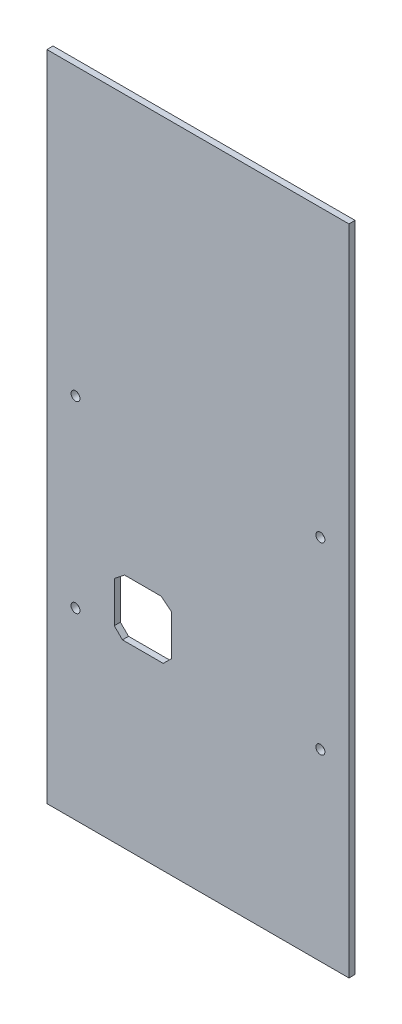
ISO-10303-21;
HEADER;
FILE_DESCRIPTION(('STEP AP214'),'2;1');
FILE_NAME('part.step','',(''),(''),'','','');
FILE_SCHEMA(('AUTOMOTIVE_DESIGN { 1 0 10303 214 1 1 1 1 }'));
ENDSEC;
DATA;
#1=APPLICATION_CONTEXT('core data for automotive mechanical design processes');
#2=APPLICATION_PROTOCOL_DEFINITION('international standard','automotive_design',2000,#1);
#3=PRODUCT_CONTEXT('',#1,'mechanical');
#4=PRODUCT('Part','Part','',(#3));
#5=PRODUCT_RELATED_PRODUCT_CATEGORY('part','',(#4));
#6=PRODUCT_DEFINITION_FORMATION('','',#4);
#7=PRODUCT_DEFINITION_CONTEXT('part definition',#1,'design');
#8=PRODUCT_DEFINITION('design','',#6,#7);
#9=PRODUCT_DEFINITION_SHAPE('','',#8);
#10=(LENGTH_UNIT() NAMED_UNIT(*) SI_UNIT(.MILLI.,.METRE.));
#11=(NAMED_UNIT(*) PLANE_ANGLE_UNIT() SI_UNIT($,.RADIAN.));
#12=(NAMED_UNIT(*) SI_UNIT($,.STERADIAN.) SOLID_ANGLE_UNIT());
#13=UNCERTAINTY_MEASURE_WITH_UNIT(LENGTH_MEASURE(1.E-05),#10,'distance_accuracy_value','');
#14=(GEOMETRIC_REPRESENTATION_CONTEXT(3) GLOBAL_UNCERTAINTY_ASSIGNED_CONTEXT((#13)) GLOBAL_UNIT_ASSIGNED_CONTEXT((#10,
#11,#12)) REPRESENTATION_CONTEXT('',''));
#15=CARTESIAN_POINT('',(0.,0.,0.));
#16=DIRECTION('',(0.,0.,1.));
#17=DIRECTION('',(1.,0.,0.));
#18=AXIS2_PLACEMENT_3D('',#15,#16,#17);
#19=CARTESIAN_POINT('',(-74.,165.,3.));
#20=DIRECTION('',(1.,0.,0.));
#21=DIRECTION('',(0.,1.,0.));
#22=AXIS2_PLACEMENT_3D('',#19,#20,#21);
#23=PLANE('',#22);
#24=DIRECTION('',(0.,-1.,0.));
#25=VECTOR('',#24,1.);
#26=CARTESIAN_POINT('',(-74.,165.,3.));
#27=LINE('',#26,#25);
#28=CARTESIAN_POINT('',(-74.,155.,3.));
#29=VERTEX_POINT('',#28);
#30=CARTESIAN_POINT('',(-74.,-165.,3.));
#31=VERTEX_POINT('',#30);
#32=EDGE_CURVE('E220',#29,#31,#27,.T.);
#33=ORIENTED_EDGE('',*,*,#32,.F.);
#34=DIRECTION('',(0.,0.,1.));
#35=VECTOR('',#34,1.);
#36=CARTESIAN_POINT('',(-74.,155.,-0.00100000000000013));
#37=LINE('',#36,#35);
#38=CARTESIAN_POINT('',(-74.,155.,0.));
#39=VERTEX_POINT('',#38);
#40=EDGE_CURVE('E202',#39,#29,#37,.T.);
#41=ORIENTED_EDGE('',*,*,#40,.F.);
#42=DIRECTION('',(0.,-1.,0.));
#43=VECTOR('',#42,1.);
#44=CARTESIAN_POINT('',(-74.,165.,0.));
#45=LINE('',#44,#43);
#46=CARTESIAN_POINT('',(-74.,-165.,0.));
#47=VERTEX_POINT('',#46);
#48=EDGE_CURVE('E211',#39,#47,#45,.T.);
#49=ORIENTED_EDGE('',*,*,#48,.T.);
#50=DIRECTION('',(0.,0.,-1.));
#51=VECTOR('',#50,1.);
#52=CARTESIAN_POINT('',(-74.,-165.,3.));
#53=LINE('',#52,#51);
#54=EDGE_CURVE('E11',#31,#47,#53,.T.);
#55=ORIENTED_EDGE('',*,*,#54,.F.);
#56=EDGE_LOOP('',(#33,#41,#49,#55));
#57=FACE_BOUND('',#56,.T.);
#58=ADVANCED_FACE('F39',(#57),#23,.F.);
#59=CARTESIAN_POINT('',(74.,-165.,3.));
#60=DIRECTION('',(0.,1.,0.));
#61=DIRECTION('',(-1.,0.,0.));
#62=AXIS2_PLACEMENT_3D('',#59,#60,#61);
#63=PLANE('',#62);
#64=DIRECTION('',(1.,0.,0.));
#65=VECTOR('',#64,1.);
#66=CARTESIAN_POINT('',(74.,-165.,0.));
#67=LINE('',#66,#65);
#68=CARTESIAN_POINT('',(74.,-165.,0.));
#69=VERTEX_POINT('',#68);
#70=EDGE_CURVE('E229',#47,#69,#67,.T.);
#71=ORIENTED_EDGE('',*,*,#70,.T.);
#72=DIRECTION('',(0.,0.,-1.));
#73=VECTOR('',#72,1.);
#74=CARTESIAN_POINT('',(74.,-165.,3.));
#75=LINE('',#74,#73);
#76=CARTESIAN_POINT('',(74.,-165.,3.));
#77=VERTEX_POINT('',#76);
#78=EDGE_CURVE('E46',#77,#69,#75,.T.);
#79=ORIENTED_EDGE('',*,*,#78,.F.);
#80=DIRECTION('',(1.,0.,0.));
#81=VECTOR('',#80,1.);
#82=CARTESIAN_POINT('',(74.,-165.,3.));
#83=LINE('',#82,#81);
#84=EDGE_CURVE('E222',#31,#77,#83,.T.);
#85=ORIENTED_EDGE('',*,*,#84,.F.);
#86=ORIENTED_EDGE('',*,*,#54,.T.);
#87=EDGE_LOOP('',(#71,#79,#85,#86));
#88=FACE_BOUND('',#87,.T.);
#89=ADVANCED_FACE('F253',(#88),#63,.F.);
#90=CARTESIAN_POINT('',(74.,165.,3.));
#91=DIRECTION('',(-1.,0.,0.));
#92=DIRECTION('',(0.,-1.,0.));
#93=AXIS2_PLACEMENT_3D('',#90,#91,#92);
#94=PLANE('',#93);
#95=DIRECTION('',(0.,1.,0.));
#96=VECTOR('',#95,1.);
#97=CARTESIAN_POINT('',(74.,165.,0.));
#98=LINE('',#97,#96);
#99=CARTESIAN_POINT('',(74.,155.,0.));
#100=VERTEX_POINT('',#99);
#101=EDGE_CURVE('E223',#69,#100,#98,.T.);
#102=ORIENTED_EDGE('',*,*,#101,.T.);
#103=DIRECTION('',(0.,0.,1.));
#104=VECTOR('',#103,1.);
#105=CARTESIAN_POINT('',(74.,155.,-0.00100000000000013));
#106=LINE('',#105,#104);
#107=CARTESIAN_POINT('',(74.,155.,3.));
#108=VERTEX_POINT('',#107);
#109=EDGE_CURVE('E203',#100,#108,#106,.T.);
#110=ORIENTED_EDGE('',*,*,#109,.T.);
#111=DIRECTION('',(0.,1.,0.));
#112=VECTOR('',#111,1.);
#113=CARTESIAN_POINT('',(74.,165.,3.));
#114=LINE('',#113,#112);
#115=EDGE_CURVE('E225',#77,#108,#114,.T.);
#116=ORIENTED_EDGE('',*,*,#115,.F.);
#117=ORIENTED_EDGE('',*,*,#78,.T.);
#118=EDGE_LOOP('',(#102,#110,#116,#117));
#119=FACE_BOUND('',#118,.T.);
#120=ADVANCED_FACE('F237',(#119),#94,.F.);
#121=CARTESIAN_POINT('',(0.,0.,3.));
#122=DIRECTION('',(0.,0.,-1.));
#123=DIRECTION('',(-1.,0.,0.));
#124=AXIS2_PLACEMENT_3D('',#121,#122,#123);
#125=PLANE('',#124);
#126=DIRECTION('',(1.,0.,0.));
#127=VECTOR('',#126,1.);
#128=CARTESIAN_POINT('',(-17.,-77.0000000000001,3.));
#129=LINE('',#128,#127);
#130=CARTESIAN_POINT('',(-37.,-77.0000000000001,3.));
#131=VERTEX_POINT('',#130);
#132=CARTESIAN_POINT('',(-17.,-77.0000000000001,3.));
#133=VERTEX_POINT('',#132);
#134=EDGE_CURVE('E148',#131,#133,#129,.T.);
#135=ORIENTED_EDGE('',*,*,#134,.F.);
#136=DIRECTION('',(0.707106781186544,-0.707106781186551,0.));
#137=VECTOR('',#136,1.);
#138=CARTESIAN_POINT('',(-41.,-73.,3.));
#139=LINE('',#138,#137);
#140=CARTESIAN_POINT('',(-41.,-73.,3.));
#141=VERTEX_POINT('',#140);
#142=EDGE_CURVE('E129',#141,#131,#139,.T.);
#143=ORIENTED_EDGE('',*,*,#142,.F.);
#144=DIRECTION('',(0.,-1.,0.));
#145=VECTOR('',#144,1.);
#146=CARTESIAN_POINT('',(-41.,-53.0000000000001,3.));
#147=LINE('',#146,#145);
#148=CARTESIAN_POINT('',(-41.,-53.0000000000001,3.));
#149=VERTEX_POINT('',#148);
#150=EDGE_CURVE('E138',#149,#141,#147,.T.);
#151=ORIENTED_EDGE('',*,*,#150,.F.);
#152=DIRECTION('',(-0.780868809443031,-0.624695047554424,0.));
#153=VECTOR('',#152,1.);
#154=CARTESIAN_POINT('',(-36.,-49.0000000000001,3.));
#155=LINE('',#154,#153);
#156=CARTESIAN_POINT('',(-36.,-49.0000000000001,3.));
#157=VERTEX_POINT('',#156);
#158=EDGE_CURVE('E53',#157,#149,#155,.T.);
#159=ORIENTED_EDGE('',*,*,#158,.F.);
#160=DIRECTION('',(-1.,0.,0.));
#161=VECTOR('',#160,1.);
#162=CARTESIAN_POINT('',(-18.,-49.0000000000001,3.));
#163=LINE('',#162,#161);
#164=CARTESIAN_POINT('',(-18.,-49.0000000000001,3.));
#165=VERTEX_POINT('',#164);
#166=EDGE_CURVE('E322',#165,#157,#163,.T.);
#167=ORIENTED_EDGE('',*,*,#166,.F.);
#168=DIRECTION('',(-0.780868809443031,0.624695047554424,0.));
#169=VECTOR('',#168,1.);
#170=CARTESIAN_POINT('',(-18.,-49.0000000000001,3.));
#171=LINE('',#170,#169);
#172=CARTESIAN_POINT('',(-13.,-53.0000000000001,3.));
#173=VERTEX_POINT('',#172);
#174=EDGE_CURVE('E317',#173,#165,#171,.T.);
#175=ORIENTED_EDGE('',*,*,#174,.F.);
#176=DIRECTION('',(0.,1.,0.));
#177=VECTOR('',#176,1.);
#178=CARTESIAN_POINT('',(-13.,-63.,3.));
#179=LINE('',#178,#177);
#180=CARTESIAN_POINT('',(-13.,-73.,3.));
#181=VERTEX_POINT('',#180);
#182=EDGE_CURVE('E316',#181,#173,#179,.T.);
#183=ORIENTED_EDGE('',*,*,#182,.F.);
#184=DIRECTION('',(0.707106781186544,0.707106781186551,0.));
#185=VECTOR('',#184,1.);
#186=CARTESIAN_POINT('',(-13.,-73.,3.));
#187=LINE('',#186,#185);
#188=EDGE_CURVE('E152',#133,#181,#187,.T.);
#189=ORIENTED_EDGE('',*,*,#188,.F.);
#190=EDGE_LOOP('',(#135,#143,#151,#159,#167,#175,#183,#189));
#191=FACE_BOUND('',#190,.T.);
#192=CARTESIAN_POINT('',(-60.,-75.,3.));
#193=DIRECTION('',(0.,0.,-1.));
#194=DIRECTION('',(-1.,0.,0.));
#195=AXIS2_PLACEMENT_3D('',#192,#193,#194);
#196=CIRCLE('',#195,2.2);
#197=CARTESIAN_POINT('',(-57.8,-75.,3.));
#198=VERTEX_POINT('',#197);
#199=EDGE_CURVE('E186',#198,#198,#196,.T.);
#200=ORIENTED_EDGE('',*,*,#199,.T.);
#201=EDGE_LOOP('',(#200));
#202=FACE_BOUND('',#201,.T.);
#203=CARTESIAN_POINT('',(-60.,14.9999999999999,3.));
#204=DIRECTION('',(0.,0.,-1.));
#205=DIRECTION('',(-1.,0.,0.));
#206=AXIS2_PLACEMENT_3D('',#203,#204,#205);
#207=CIRCLE('',#206,2.2);
#208=CARTESIAN_POINT('',(-57.8,14.9999999999999,3.));
#209=VERTEX_POINT('',#208);
#210=EDGE_CURVE('E141',#209,#209,#207,.T.);
#211=ORIENTED_EDGE('',*,*,#210,.T.);
#212=EDGE_LOOP('',(#211));
#213=FACE_BOUND('',#212,.T.);
#214=CARTESIAN_POINT('',(60.,-75.,3.));
#215=DIRECTION('',(0.,0.,1.));
#216=DIRECTION('',(1.,0.,0.));
#217=AXIS2_PLACEMENT_3D('',#214,#215,#216);
#218=CIRCLE('',#217,2.2);
#219=CARTESIAN_POINT('',(62.2,-75.,3.));
#220=VERTEX_POINT('',#219);
#221=EDGE_CURVE('E208',#220,#220,#218,.T.);
#222=ORIENTED_EDGE('',*,*,#221,.F.);
#223=EDGE_LOOP('',(#222));
#224=FACE_BOUND('',#223,.T.);
#225=CARTESIAN_POINT('',(60.,14.9999999999999,3.));
#226=DIRECTION('',(0.,0.,1.));
#227=DIRECTION('',(1.,0.,0.));
#228=AXIS2_PLACEMENT_3D('',#225,#226,#227);
#229=CIRCLE('',#228,2.2);
#230=CARTESIAN_POINT('',(62.2,14.9999999999999,3.));
#231=VERTEX_POINT('',#230);
#232=EDGE_CURVE('E215',#231,#231,#229,.T.);
#233=ORIENTED_EDGE('',*,*,#232,.F.);
#234=EDGE_LOOP('',(#233));
#235=FACE_BOUND('',#234,.T.);
#236=ORIENTED_EDGE('',*,*,#115,.T.);
#237=DIRECTION('',(1.,0.,0.));
#238=VECTOR('',#237,1.);
#239=CARTESIAN_POINT('',(-74.,155.,3.));
#240=LINE('',#239,#238);
#241=EDGE_CURVE('E200',#29,#108,#240,.T.);
#242=ORIENTED_EDGE('',*,*,#241,.F.);
#243=ORIENTED_EDGE('',*,*,#32,.T.);
#244=ORIENTED_EDGE('',*,*,#84,.T.);
#245=EDGE_LOOP('',(#236,#242,#243,#244));
#246=FACE_BOUND('',#245,.T.);
#247=ADVANCED_FACE('F144',(#191,#202,#213,#224,#235,#246),#125,.F.);
#248=CARTESIAN_POINT('',(0.,0.,0.));
#249=DIRECTION('',(0.,0.,-1.));
#250=DIRECTION('',(-1.,0.,0.));
#251=AXIS2_PLACEMENT_3D('',#248,#249,#250);
#252=PLANE('',#251);
#253=DIRECTION('',(-0.707106781186544,0.707106781186551,0.));
#254=VECTOR('',#253,1.);
#255=CARTESIAN_POINT('',(-41.,-73.,0.));
#256=LINE('',#255,#254);
#257=CARTESIAN_POINT('',(-37.,-77.0000000000001,0.));
#258=VERTEX_POINT('',#257);
#259=CARTESIAN_POINT('',(-41.,-73.,0.));
#260=VERTEX_POINT('',#259);
#261=EDGE_CURVE('E61',#258,#260,#256,.T.);
#262=ORIENTED_EDGE('',*,*,#261,.F.);
#263=DIRECTION('',(-1.,0.,0.));
#264=VECTOR('',#263,1.);
#265=CARTESIAN_POINT('',(-17.,-77.0000000000001,0.));
#266=LINE('',#265,#264);
#267=CARTESIAN_POINT('',(-17.,-77.0000000000001,0.));
#268=VERTEX_POINT('',#267);
#269=EDGE_CURVE('E135',#268,#258,#266,.T.);
#270=ORIENTED_EDGE('',*,*,#269,.F.);
#271=DIRECTION('',(-0.707106781186544,-0.707106781186551,0.));
#272=VECTOR('',#271,1.);
#273=CARTESIAN_POINT('',(-13.,-73.,0.));
#274=LINE('',#273,#272);
#275=CARTESIAN_POINT('',(-13.,-73.,0.));
#276=VERTEX_POINT('',#275);
#277=EDGE_CURVE('E169',#276,#268,#274,.T.);
#278=ORIENTED_EDGE('',*,*,#277,.F.);
#279=DIRECTION('',(0.,-1.,0.));
#280=VECTOR('',#279,1.);
#281=CARTESIAN_POINT('',(-13.,-63.,0.));
#282=LINE('',#281,#280);
#283=CARTESIAN_POINT('',(-13.,-53.0000000000001,0.));
#284=VERTEX_POINT('',#283);
#285=EDGE_CURVE('E166',#284,#276,#282,.T.);
#286=ORIENTED_EDGE('',*,*,#285,.F.);
#287=DIRECTION('',(0.780868809443031,-0.624695047554424,0.));
#288=VECTOR('',#287,1.);
#289=CARTESIAN_POINT('',(-18.,-49.0000000000001,0.));
#290=LINE('',#289,#288);
#291=CARTESIAN_POINT('',(-18.,-49.0000000000001,0.));
#292=VERTEX_POINT('',#291);
#293=EDGE_CURVE('E163',#292,#284,#290,.T.);
#294=ORIENTED_EDGE('',*,*,#293,.F.);
#295=DIRECTION('',(1.,0.,0.));
#296=VECTOR('',#295,1.);
#297=CARTESIAN_POINT('',(-18.,-49.0000000000001,0.));
#298=LINE('',#297,#296);
#299=CARTESIAN_POINT('',(-36.,-49.0000000000001,0.));
#300=VERTEX_POINT('',#299);
#301=EDGE_CURVE('E160',#300,#292,#298,.T.);
#302=ORIENTED_EDGE('',*,*,#301,.F.);
#303=DIRECTION('',(0.780868809443031,0.624695047554424,0.));
#304=VECTOR('',#303,1.);
#305=CARTESIAN_POINT('',(-36.,-49.0000000000001,0.));
#306=LINE('',#305,#304);
#307=CARTESIAN_POINT('',(-41.,-53.0000000000001,0.));
#308=VERTEX_POINT('',#307);
#309=EDGE_CURVE('E157',#308,#300,#306,.T.);
#310=ORIENTED_EDGE('',*,*,#309,.F.);
#311=DIRECTION('',(0.,1.,0.));
#312=VECTOR('',#311,1.);
#313=CARTESIAN_POINT('',(-41.,-53.0000000000001,0.));
#314=LINE('',#313,#312);
#315=EDGE_CURVE('E150',#260,#308,#314,.T.);
#316=ORIENTED_EDGE('',*,*,#315,.F.);
#317=EDGE_LOOP('',(#262,#270,#278,#286,#294,#302,#310,#316));
#318=FACE_BOUND('',#317,.T.);
#319=CARTESIAN_POINT('',(-60.,-75.,0.));
#320=DIRECTION('',(0.,0.,-1.));
#321=DIRECTION('',(-1.,0.,0.));
#322=AXIS2_PLACEMENT_3D('',#319,#320,#321);
#323=CIRCLE('',#322,2.2);
#324=CARTESIAN_POINT('',(-57.8,-75.,0.));
#325=VERTEX_POINT('',#324);
#326=EDGE_CURVE('E189',#325,#325,#323,.T.);
#327=ORIENTED_EDGE('',*,*,#326,.F.);
#328=EDGE_LOOP('',(#327));
#329=FACE_BOUND('',#328,.T.);
#330=CARTESIAN_POINT('',(-60.,14.9999999999999,0.));
#331=DIRECTION('',(0.,0.,-1.));
#332=DIRECTION('',(-1.,0.,0.));
#333=AXIS2_PLACEMENT_3D('',#330,#331,#332);
#334=CIRCLE('',#333,2.2);
#335=CARTESIAN_POINT('',(-57.8,14.9999999999999,0.));
#336=VERTEX_POINT('',#335);
#337=EDGE_CURVE('E190',#336,#336,#334,.T.);
#338=ORIENTED_EDGE('',*,*,#337,.F.);
#339=EDGE_LOOP('',(#338));
#340=FACE_BOUND('',#339,.T.);
#341=DIRECTION('',(1.,0.,0.));
#342=VECTOR('',#341,1.);
#343=CARTESIAN_POINT('',(-74.,155.,0.));
#344=LINE('',#343,#342);
#345=EDGE_CURVE('E193',#39,#100,#344,.T.);
#346=ORIENTED_EDGE('',*,*,#345,.T.);
#347=ORIENTED_EDGE('',*,*,#101,.F.);
#348=ORIENTED_EDGE('',*,*,#70,.F.);
#349=ORIENTED_EDGE('',*,*,#48,.F.);
#350=EDGE_LOOP('',(#346,#347,#348,#349));
#351=FACE_BOUND('',#350,.T.);
#352=CARTESIAN_POINT('',(60.,-75.,0.));
#353=DIRECTION('',(0.,0.,-1.));
#354=DIRECTION('',(-1.,0.,0.));
#355=AXIS2_PLACEMENT_3D('',#352,#353,#354);
#356=CIRCLE('',#355,2.2);
#357=CARTESIAN_POINT('',(62.2,-75.,0.));
#358=VERTEX_POINT('',#357);
#359=EDGE_CURVE('E212',#358,#358,#356,.F.);
#360=ORIENTED_EDGE('',*,*,#359,.T.);
#361=EDGE_LOOP('',(#360));
#362=FACE_BOUND('',#361,.T.);
#363=CARTESIAN_POINT('',(60.,14.9999999999999,0.));
#364=DIRECTION('',(0.,0.,-1.));
#365=DIRECTION('',(-1.,0.,0.));
#366=AXIS2_PLACEMENT_3D('',#363,#364,#365);
#367=CIRCLE('',#366,2.2);
#368=CARTESIAN_POINT('',(62.2,14.9999999999999,0.));
#369=VERTEX_POINT('',#368);
#370=EDGE_CURVE('E206',#369,#369,#367,.F.);
#371=ORIENTED_EDGE('',*,*,#370,.T.);
#372=EDGE_LOOP('',(#371));
#373=FACE_BOUND('',#372,.T.);
#374=ADVANCED_FACE('F242',(#318,#329,#340,#351,#362,#373),#252,.T.);
#375=CARTESIAN_POINT('',(60.,14.9999999999999,-0.00100000000000013));
#376=DIRECTION('',(0.,0.,1.));
#377=DIRECTION('',(1.,0.,0.));
#378=AXIS2_PLACEMENT_3D('',#375,#376,#377);
#379=CYLINDRICAL_SURFACE('',#378,2.2);
#380=CARTESIAN_POINT('',(62.2,14.9999999999999,0.));
#381=CARTESIAN_POINT('',(62.2,14.9999999999999,0.03125));
#382=CARTESIAN_POINT('',(62.2,14.9999999999999,0.0625));
#383=CARTESIAN_POINT('',(62.2,14.9999999999999,0.125));
#384=CARTESIAN_POINT('',(62.2,14.9999999999999,0.15625));
#385=CARTESIAN_POINT('',(62.2,14.9999999999999,0.21875));
#386=CARTESIAN_POINT('',(62.2,14.9999999999999,0.25));
#387=CARTESIAN_POINT('',(62.2,14.9999999999999,0.3125));
#388=CARTESIAN_POINT('',(62.2,14.9999999999999,0.34375));
#389=CARTESIAN_POINT('',(62.2,14.9999999999999,0.40625));
#390=CARTESIAN_POINT('',(62.2,14.9999999999999,0.4375));
#391=CARTESIAN_POINT('',(62.2,14.9999999999999,0.5));
#392=CARTESIAN_POINT('',(62.2,14.9999999999999,0.53125));
#393=CARTESIAN_POINT('',(62.2,14.9999999999999,0.59375));
#394=CARTESIAN_POINT('',(62.2,14.9999999999999,0.625));
#395=CARTESIAN_POINT('',(62.2,14.9999999999999,0.6875));
#396=CARTESIAN_POINT('',(62.2,14.9999999999999,0.71875));
#397=CARTESIAN_POINT('',(62.2,14.9999999999999,0.78125));
#398=CARTESIAN_POINT('',(62.2,14.9999999999999,0.8125));
#399=CARTESIAN_POINT('',(62.2,14.9999999999999,0.875));
#400=CARTESIAN_POINT('',(62.2,14.9999999999999,0.90625));
#401=CARTESIAN_POINT('',(62.2,14.9999999999999,0.96875));
#402=CARTESIAN_POINT('',(62.2,14.9999999999999,1.));
#403=CARTESIAN_POINT('',(62.2,14.9999999999999,1.0625));
#404=CARTESIAN_POINT('',(62.2,14.9999999999999,1.09375));
#405=CARTESIAN_POINT('',(62.2,14.9999999999999,1.15625));
#406=CARTESIAN_POINT('',(62.2,14.9999999999999,1.1875));
#407=CARTESIAN_POINT('',(62.2,14.9999999999999,1.25));
#408=CARTESIAN_POINT('',(62.2,14.9999999999999,1.28125));
#409=CARTESIAN_POINT('',(62.2,14.9999999999999,1.34375));
#410=CARTESIAN_POINT('',(62.2,14.9999999999999,1.375));
#411=CARTESIAN_POINT('',(62.2,14.9999999999999,1.4375));
#412=CARTESIAN_POINT('',(62.2,14.9999999999999,1.46875));
#413=CARTESIAN_POINT('',(62.2,14.9999999999999,1.53125));
#414=CARTESIAN_POINT('',(62.2,14.9999999999999,1.5625));
#415=CARTESIAN_POINT('',(62.2,14.9999999999999,1.625));
#416=CARTESIAN_POINT('',(62.2,14.9999999999999,1.65625));
#417=CARTESIAN_POINT('',(62.2,14.9999999999999,1.71875));
#418=CARTESIAN_POINT('',(62.2,14.9999999999999,1.75));
#419=CARTESIAN_POINT('',(62.2,14.9999999999999,1.8125));
#420=CARTESIAN_POINT('',(62.2,14.9999999999999,1.84375));
#421=CARTESIAN_POINT('',(62.2,14.9999999999999,1.90625));
#422=CARTESIAN_POINT('',(62.2,14.9999999999999,1.9375));
#423=CARTESIAN_POINT('',(62.2,14.9999999999999,2.));
#424=CARTESIAN_POINT('',(62.2,14.9999999999999,2.03125));
#425=CARTESIAN_POINT('',(62.2,14.9999999999999,2.09375));
#426=CARTESIAN_POINT('',(62.2,14.9999999999999,2.125));
#427=CARTESIAN_POINT('',(62.2,14.9999999999999,2.1875));
#428=CARTESIAN_POINT('',(62.2,14.9999999999999,2.21875));
#429=CARTESIAN_POINT('',(62.2,14.9999999999999,2.28125));
#430=CARTESIAN_POINT('',(62.2,14.9999999999999,2.3125));
#431=CARTESIAN_POINT('',(62.2,14.9999999999999,2.375));
#432=CARTESIAN_POINT('',(62.2,14.9999999999999,2.40625));
#433=CARTESIAN_POINT('',(62.2,14.9999999999999,2.46875));
#434=CARTESIAN_POINT('',(62.2,14.9999999999999,2.5));
#435=CARTESIAN_POINT('',(62.2,14.9999999999999,2.5625));
#436=CARTESIAN_POINT('',(62.2,14.9999999999999,2.59375));
#437=CARTESIAN_POINT('',(62.2,14.9999999999999,2.65625));
#438=CARTESIAN_POINT('',(62.2,14.9999999999999,2.6875));
#439=CARTESIAN_POINT('',(62.2,14.9999999999999,2.75));
#440=CARTESIAN_POINT('',(62.2,14.9999999999999,2.78125));
#441=CARTESIAN_POINT('',(62.2,14.9999999999999,2.84375));
#442=CARTESIAN_POINT('',(62.2,14.9999999999999,2.875));
#443=CARTESIAN_POINT('',(62.2,14.9999999999999,2.9375));
#444=CARTESIAN_POINT('',(62.2,14.9999999999999,2.96875));
#445=CARTESIAN_POINT('',(62.2,14.9999999999999,3.));
#446=B_SPLINE_CURVE_WITH_KNOTS('',3,(#380,#381,#382,#383,#384,#385,#386,#387,#388,#389,#390,
#391,#392,#393,#394,#395,#396,#397,#398,#399,#400,#401,#402,#403,#404,#405,#406,#407,#408,#409,
#410,#411,#412,#413,#414,#415,#416,#417,#418,#419,#420,#421,#422,#423,#424,#425,#426,#427,#428,
#429,#430,#431,#432,#433,#434,#435,#436,#437,#438,#439,#440,#441,#442,#443,#444,#445),
.UNSPECIFIED.,.F.,.F.,(4,2,2,2,2,2,2,2,2,2,2,2,2,2,2,2,2,2,2,2,2,2,2,2,2,2,2,2,2,2,2,2,4),(0.,
0.09375,0.1875,0.28125,0.375,0.46875,0.5625,0.65625,0.75,0.84375,0.9375,1.03125,1.125,1.21875,
1.3125,1.40625,1.5,1.59375,1.6875,1.78125,1.875,1.96875,2.0625,2.15625,2.25,2.34375,2.4375,
2.53125,2.625,2.71875,2.8125,2.90625,3.),.UNSPECIFIED.);
#447=EDGE_CURVE('BSEAM263',#369,#231,#446,.T.);
#448=ORIENTED_EDGE('',*,*,#370,.F.);
#449=ORIENTED_EDGE('',*,*,#232,.T.);
#450=ORIENTED_EDGE('',*,*,#447,.T.);
#451=ORIENTED_EDGE('',*,*,#447,.F.);
#452=EDGE_LOOP('',(#448,#450,#449,#451));
#453=FACE_BOUND('',#452,.T.);
#454=ADVANCED_FACE('F263',(#453),#379,.F.);
#455=CARTESIAN_POINT('',(60.,-75.,-0.00100000000000013));
#456=DIRECTION('',(0.,0.,1.));
#457=DIRECTION('',(1.,0.,0.));
#458=AXIS2_PLACEMENT_3D('',#455,#456,#457);
#459=CYLINDRICAL_SURFACE('',#458,2.2);
#460=CARTESIAN_POINT('',(62.2,-75.,0.));
#461=CARTESIAN_POINT('',(62.2,-75.,0.03125));
#462=CARTESIAN_POINT('',(62.2,-75.,0.0625));
#463=CARTESIAN_POINT('',(62.2,-75.,0.125));
#464=CARTESIAN_POINT('',(62.2,-75.,0.15625));
#465=CARTESIAN_POINT('',(62.2,-75.,0.21875));
#466=CARTESIAN_POINT('',(62.2,-75.,0.25));
#467=CARTESIAN_POINT('',(62.2,-75.,0.3125));
#468=CARTESIAN_POINT('',(62.2,-75.,0.34375));
#469=CARTESIAN_POINT('',(62.2,-75.,0.40625));
#470=CARTESIAN_POINT('',(62.2,-75.,0.4375));
#471=CARTESIAN_POINT('',(62.2,-75.,0.5));
#472=CARTESIAN_POINT('',(62.2,-75.,0.53125));
#473=CARTESIAN_POINT('',(62.2,-75.,0.59375));
#474=CARTESIAN_POINT('',(62.2,-75.,0.625));
#475=CARTESIAN_POINT('',(62.2,-75.,0.6875));
#476=CARTESIAN_POINT('',(62.2,-75.,0.71875));
#477=CARTESIAN_POINT('',(62.2,-75.,0.78125));
#478=CARTESIAN_POINT('',(62.2,-75.,0.8125));
#479=CARTESIAN_POINT('',(62.2,-75.,0.875));
#480=CARTESIAN_POINT('',(62.2,-75.,0.90625));
#481=CARTESIAN_POINT('',(62.2,-75.,0.96875));
#482=CARTESIAN_POINT('',(62.2,-75.,1.));
#483=CARTESIAN_POINT('',(62.2,-75.,1.0625));
#484=CARTESIAN_POINT('',(62.2,-75.,1.09375));
#485=CARTESIAN_POINT('',(62.2,-75.,1.15625));
#486=CARTESIAN_POINT('',(62.2,-75.,1.1875));
#487=CARTESIAN_POINT('',(62.2,-75.,1.25));
#488=CARTESIAN_POINT('',(62.2,-75.,1.28125));
#489=CARTESIAN_POINT('',(62.2,-75.,1.34375));
#490=CARTESIAN_POINT('',(62.2,-75.,1.375));
#491=CARTESIAN_POINT('',(62.2,-75.,1.4375));
#492=CARTESIAN_POINT('',(62.2,-75.,1.46875));
#493=CARTESIAN_POINT('',(62.2,-75.,1.53125));
#494=CARTESIAN_POINT('',(62.2,-75.,1.5625));
#495=CARTESIAN_POINT('',(62.2,-75.,1.625));
#496=CARTESIAN_POINT('',(62.2,-75.,1.65625));
#497=CARTESIAN_POINT('',(62.2,-75.,1.71875));
#498=CARTESIAN_POINT('',(62.2,-75.,1.75));
#499=CARTESIAN_POINT('',(62.2,-75.,1.8125));
#500=CARTESIAN_POINT('',(62.2,-75.,1.84375));
#501=CARTESIAN_POINT('',(62.2,-75.,1.90625));
#502=CARTESIAN_POINT('',(62.2,-75.,1.9375));
#503=CARTESIAN_POINT('',(62.2,-75.,2.));
#504=CARTESIAN_POINT('',(62.2,-75.,2.03125));
#505=CARTESIAN_POINT('',(62.2,-75.,2.09375));
#506=CARTESIAN_POINT('',(62.2,-75.,2.125));
#507=CARTESIAN_POINT('',(62.2,-75.,2.1875));
#508=CARTESIAN_POINT('',(62.2,-75.,2.21875));
#509=CARTESIAN_POINT('',(62.2,-75.,2.28125));
#510=CARTESIAN_POINT('',(62.2,-75.,2.3125));
#511=CARTESIAN_POINT('',(62.2,-75.,2.375));
#512=CARTESIAN_POINT('',(62.2,-75.,2.40625));
#513=CARTESIAN_POINT('',(62.2,-75.,2.46875));
#514=CARTESIAN_POINT('',(62.2,-75.,2.5));
#515=CARTESIAN_POINT('',(62.2,-75.,2.5625));
#516=CARTESIAN_POINT('',(62.2,-75.,2.59375));
#517=CARTESIAN_POINT('',(62.2,-75.,2.65625));
#518=CARTESIAN_POINT('',(62.2,-75.,2.6875));
#519=CARTESIAN_POINT('',(62.2,-75.,2.75));
#520=CARTESIAN_POINT('',(62.2,-75.,2.78125));
#521=CARTESIAN_POINT('',(62.2,-75.,2.84375));
#522=CARTESIAN_POINT('',(62.2,-75.,2.875));
#523=CARTESIAN_POINT('',(62.2,-75.,2.9375));
#524=CARTESIAN_POINT('',(62.2,-75.,2.96875));
#525=CARTESIAN_POINT('',(62.2,-75.,3.));
#526=B_SPLINE_CURVE_WITH_KNOTS('',3,(#460,#461,#462,#463,#464,#465,#466,#467,#468,#469,#470,
#471,#472,#473,#474,#475,#476,#477,#478,#479,#480,#481,#482,#483,#484,#485,#486,#487,#488,#489,
#490,#491,#492,#493,#494,#495,#496,#497,#498,#499,#500,#501,#502,#503,#504,#505,#506,#507,#508,
#509,#510,#511,#512,#513,#514,#515,#516,#517,#518,#519,#520,#521,#522,#523,#524,#525),
.UNSPECIFIED.,.F.,.F.,(4,2,2,2,2,2,2,2,2,2,2,2,2,2,2,2,2,2,2,2,2,2,2,2,2,2,2,2,2,2,2,2,4),(0.,
0.09375,0.1875,0.28125,0.375,0.46875,0.5625,0.65625,0.75,0.84375,0.9375,1.03125,1.125,1.21875,
1.3125,1.40625,1.5,1.59375,1.6875,1.78125,1.875,1.96875,2.0625,2.15625,2.25,2.34375,2.4375,
2.53125,2.625,2.71875,2.8125,2.90625,3.),.UNSPECIFIED.);
#527=EDGE_CURVE('BSEAM269',#358,#220,#526,.T.);
#528=ORIENTED_EDGE('',*,*,#359,.F.);
#529=ORIENTED_EDGE('',*,*,#221,.T.);
#530=ORIENTED_EDGE('',*,*,#527,.T.);
#531=ORIENTED_EDGE('',*,*,#527,.F.);
#532=EDGE_LOOP('',(#528,#530,#529,#531));
#533=FACE_BOUND('',#532,.T.);
#534=ADVANCED_FACE('F269',(#533),#459,.F.);
#535=CARTESIAN_POINT('',(-74.,155.,-0.00100000000000013));
#536=DIRECTION('',(0.,-1.,0.));
#537=DIRECTION('',(0.,0.,-1.));
#538=AXIS2_PLACEMENT_3D('',#535,#536,#537);
#539=PLANE('',#538);
#540=ORIENTED_EDGE('',*,*,#40,.T.);
#541=ORIENTED_EDGE('',*,*,#241,.T.);
#542=ORIENTED_EDGE('',*,*,#109,.F.);
#543=ORIENTED_EDGE('',*,*,#345,.F.);
#544=EDGE_LOOP('',(#540,#541,#542,#543));
#545=FACE_BOUND('',#544,.T.);
#546=ADVANCED_FACE('F247',(#545),#539,.F.);
#547=CARTESIAN_POINT('',(-60.,14.9999999999999,-0.00100000000000013));
#548=DIRECTION('',(0.,0.,1.));
#549=DIRECTION('',(1.,0.,0.));
#550=AXIS2_PLACEMENT_3D('',#547,#548,#549);
#551=CYLINDRICAL_SURFACE('',#550,2.2);
#552=CARTESIAN_POINT('',(-57.8,14.9999999999999,0.));
#553=CARTESIAN_POINT('',(-57.8,14.9999999999999,0.03125));
#554=CARTESIAN_POINT('',(-57.8,14.9999999999999,0.0625));
#555=CARTESIAN_POINT('',(-57.8,14.9999999999999,0.125));
#556=CARTESIAN_POINT('',(-57.8,14.9999999999999,0.15625));
#557=CARTESIAN_POINT('',(-57.8,14.9999999999999,0.21875));
#558=CARTESIAN_POINT('',(-57.8,14.9999999999999,0.25));
#559=CARTESIAN_POINT('',(-57.8,14.9999999999999,0.3125));
#560=CARTESIAN_POINT('',(-57.8,14.9999999999999,0.34375));
#561=CARTESIAN_POINT('',(-57.8,14.9999999999999,0.40625));
#562=CARTESIAN_POINT('',(-57.8,14.9999999999999,0.4375));
#563=CARTESIAN_POINT('',(-57.8,14.9999999999999,0.5));
#564=CARTESIAN_POINT('',(-57.8,14.9999999999999,0.53125));
#565=CARTESIAN_POINT('',(-57.8,14.9999999999999,0.59375));
#566=CARTESIAN_POINT('',(-57.8,14.9999999999999,0.625));
#567=CARTESIAN_POINT('',(-57.8,14.9999999999999,0.6875));
#568=CARTESIAN_POINT('',(-57.8,14.9999999999999,0.71875));
#569=CARTESIAN_POINT('',(-57.8,14.9999999999999,0.78125));
#570=CARTESIAN_POINT('',(-57.8,14.9999999999999,0.8125));
#571=CARTESIAN_POINT('',(-57.8,14.9999999999999,0.875));
#572=CARTESIAN_POINT('',(-57.8,14.9999999999999,0.90625));
#573=CARTESIAN_POINT('',(-57.8,14.9999999999999,0.96875));
#574=CARTESIAN_POINT('',(-57.8,14.9999999999999,1.));
#575=CARTESIAN_POINT('',(-57.8,14.9999999999999,1.0625));
#576=CARTESIAN_POINT('',(-57.8,14.9999999999999,1.09375));
#577=CARTESIAN_POINT('',(-57.8,14.9999999999999,1.15625));
#578=CARTESIAN_POINT('',(-57.8,14.9999999999999,1.1875));
#579=CARTESIAN_POINT('',(-57.8,14.9999999999999,1.25));
#580=CARTESIAN_POINT('',(-57.8,14.9999999999999,1.28125));
#581=CARTESIAN_POINT('',(-57.8,14.9999999999999,1.34375));
#582=CARTESIAN_POINT('',(-57.8,14.9999999999999,1.375));
#583=CARTESIAN_POINT('',(-57.8,14.9999999999999,1.4375));
#584=CARTESIAN_POINT('',(-57.8,14.9999999999999,1.46875));
#585=CARTESIAN_POINT('',(-57.8,14.9999999999999,1.53125));
#586=CARTESIAN_POINT('',(-57.8,14.9999999999999,1.5625));
#587=CARTESIAN_POINT('',(-57.8,14.9999999999999,1.625));
#588=CARTESIAN_POINT('',(-57.8,14.9999999999999,1.65625));
#589=CARTESIAN_POINT('',(-57.8,14.9999999999999,1.71875));
#590=CARTESIAN_POINT('',(-57.8,14.9999999999999,1.75));
#591=CARTESIAN_POINT('',(-57.8,14.9999999999999,1.8125));
#592=CARTESIAN_POINT('',(-57.8,14.9999999999999,1.84375));
#593=CARTESIAN_POINT('',(-57.8,14.9999999999999,1.90625));
#594=CARTESIAN_POINT('',(-57.8,14.9999999999999,1.9375));
#595=CARTESIAN_POINT('',(-57.8,14.9999999999999,2.));
#596=CARTESIAN_POINT('',(-57.8,14.9999999999999,2.03125));
#597=CARTESIAN_POINT('',(-57.8,14.9999999999999,2.09375));
#598=CARTESIAN_POINT('',(-57.8,14.9999999999999,2.125));
#599=CARTESIAN_POINT('',(-57.8,14.9999999999999,2.1875));
#600=CARTESIAN_POINT('',(-57.8,14.9999999999999,2.21875));
#601=CARTESIAN_POINT('',(-57.8,14.9999999999999,2.28125));
#602=CARTESIAN_POINT('',(-57.8,14.9999999999999,2.3125));
#603=CARTESIAN_POINT('',(-57.8,14.9999999999999,2.375));
#604=CARTESIAN_POINT('',(-57.8,14.9999999999999,2.40625));
#605=CARTESIAN_POINT('',(-57.8,14.9999999999999,2.46875));
#606=CARTESIAN_POINT('',(-57.8,14.9999999999999,2.5));
#607=CARTESIAN_POINT('',(-57.8,14.9999999999999,2.5625));
#608=CARTESIAN_POINT('',(-57.8,14.9999999999999,2.59375));
#609=CARTESIAN_POINT('',(-57.8,14.9999999999999,2.65625));
#610=CARTESIAN_POINT('',(-57.8,14.9999999999999,2.6875));
#611=CARTESIAN_POINT('',(-57.8,14.9999999999999,2.75));
#612=CARTESIAN_POINT('',(-57.8,14.9999999999999,2.78125));
#613=CARTESIAN_POINT('',(-57.8,14.9999999999999,2.84375));
#614=CARTESIAN_POINT('',(-57.8,14.9999999999999,2.875));
#615=CARTESIAN_POINT('',(-57.8,14.9999999999999,2.9375));
#616=CARTESIAN_POINT('',(-57.8,14.9999999999999,2.96875));
#617=CARTESIAN_POINT('',(-57.8,14.9999999999999,3.));
#618=B_SPLINE_CURVE_WITH_KNOTS('',3,(#552,#553,#554,#555,#556,#557,#558,#559,#560,#561,#562,
#563,#564,#565,#566,#567,#568,#569,#570,#571,#572,#573,#574,#575,#576,#577,#578,#579,#580,#581,
#582,#583,#584,#585,#586,#587,#588,#589,#590,#591,#592,#593,#594,#595,#596,#597,#598,#599,#600,
#601,#602,#603,#604,#605,#606,#607,#608,#609,#610,#611,#612,#613,#614,#615,#616,#617),
.UNSPECIFIED.,.F.,.F.,(4,2,2,2,2,2,2,2,2,2,2,2,2,2,2,2,2,2,2,2,2,2,2,2,2,2,2,2,2,2,2,2,4),(0.,
0.09375,0.1875,0.28125,0.375,0.46875,0.5625,0.65625,0.75,0.84375,0.9375,1.03125,1.125,1.21875,
1.3125,1.40625,1.5,1.59375,1.6875,1.78125,1.875,1.96875,2.0625,2.15625,2.25,2.34375,2.4375,
2.53125,2.625,2.71875,2.8125,2.90625,3.),.UNSPECIFIED.);
#619=EDGE_CURVE('BSEAM276',#336,#209,#618,.T.);
#620=ORIENTED_EDGE('',*,*,#337,.T.);
#621=ORIENTED_EDGE('',*,*,#210,.F.);
#622=ORIENTED_EDGE('',*,*,#619,.T.);
#623=ORIENTED_EDGE('',*,*,#619,.F.);
#624=EDGE_LOOP('',(#620,#622,#621,#623));
#625=FACE_BOUND('',#624,.T.);
#626=ADVANCED_FACE('F276',(#625),#551,.F.);
#627=CARTESIAN_POINT('',(-60.,-75.,-0.00100000000000013));
#628=DIRECTION('',(0.,0.,1.));
#629=DIRECTION('',(1.,0.,0.));
#630=AXIS2_PLACEMENT_3D('',#627,#628,#629);
#631=CYLINDRICAL_SURFACE('',#630,2.2);
#632=CARTESIAN_POINT('',(-57.8,-75.,0.));
#633=CARTESIAN_POINT('',(-57.8,-75.,0.03125));
#634=CARTESIAN_POINT('',(-57.8,-75.,0.0625));
#635=CARTESIAN_POINT('',(-57.8,-75.,0.125));
#636=CARTESIAN_POINT('',(-57.8,-75.,0.15625));
#637=CARTESIAN_POINT('',(-57.8,-75.,0.21875));
#638=CARTESIAN_POINT('',(-57.8,-75.,0.25));
#639=CARTESIAN_POINT('',(-57.8,-75.,0.3125));
#640=CARTESIAN_POINT('',(-57.8,-75.,0.34375));
#641=CARTESIAN_POINT('',(-57.8,-75.,0.40625));
#642=CARTESIAN_POINT('',(-57.8,-75.,0.4375));
#643=CARTESIAN_POINT('',(-57.8,-75.,0.5));
#644=CARTESIAN_POINT('',(-57.8,-75.,0.53125));
#645=CARTESIAN_POINT('',(-57.8,-75.,0.59375));
#646=CARTESIAN_POINT('',(-57.8,-75.,0.625));
#647=CARTESIAN_POINT('',(-57.8,-75.,0.6875));
#648=CARTESIAN_POINT('',(-57.8,-75.,0.71875));
#649=CARTESIAN_POINT('',(-57.8,-75.,0.78125));
#650=CARTESIAN_POINT('',(-57.8,-75.,0.8125));
#651=CARTESIAN_POINT('',(-57.8,-75.,0.875));
#652=CARTESIAN_POINT('',(-57.8,-75.,0.90625));
#653=CARTESIAN_POINT('',(-57.8,-75.,0.96875));
#654=CARTESIAN_POINT('',(-57.8,-75.,1.));
#655=CARTESIAN_POINT('',(-57.8,-75.,1.0625));
#656=CARTESIAN_POINT('',(-57.8,-75.,1.09375));
#657=CARTESIAN_POINT('',(-57.8,-75.,1.15625));
#658=CARTESIAN_POINT('',(-57.8,-75.,1.1875));
#659=CARTESIAN_POINT('',(-57.8,-75.,1.25));
#660=CARTESIAN_POINT('',(-57.8,-75.,1.28125));
#661=CARTESIAN_POINT('',(-57.8,-75.,1.34375));
#662=CARTESIAN_POINT('',(-57.8,-75.,1.375));
#663=CARTESIAN_POINT('',(-57.8,-75.,1.4375));
#664=CARTESIAN_POINT('',(-57.8,-75.,1.46875));
#665=CARTESIAN_POINT('',(-57.8,-75.,1.53125));
#666=CARTESIAN_POINT('',(-57.8,-75.,1.5625));
#667=CARTESIAN_POINT('',(-57.8,-75.,1.625));
#668=CARTESIAN_POINT('',(-57.8,-75.,1.65625));
#669=CARTESIAN_POINT('',(-57.8,-75.,1.71875));
#670=CARTESIAN_POINT('',(-57.8,-75.,1.75));
#671=CARTESIAN_POINT('',(-57.8,-75.,1.8125));
#672=CARTESIAN_POINT('',(-57.8,-75.,1.84375));
#673=CARTESIAN_POINT('',(-57.8,-75.,1.90625));
#674=CARTESIAN_POINT('',(-57.8,-75.,1.9375));
#675=CARTESIAN_POINT('',(-57.8,-75.,2.));
#676=CARTESIAN_POINT('',(-57.8,-75.,2.03125));
#677=CARTESIAN_POINT('',(-57.8,-75.,2.09375));
#678=CARTESIAN_POINT('',(-57.8,-75.,2.125));
#679=CARTESIAN_POINT('',(-57.8,-75.,2.1875));
#680=CARTESIAN_POINT('',(-57.8,-75.,2.21875));
#681=CARTESIAN_POINT('',(-57.8,-75.,2.28125));
#682=CARTESIAN_POINT('',(-57.8,-75.,2.3125));
#683=CARTESIAN_POINT('',(-57.8,-75.,2.375));
#684=CARTESIAN_POINT('',(-57.8,-75.,2.40625));
#685=CARTESIAN_POINT('',(-57.8,-75.,2.46875));
#686=CARTESIAN_POINT('',(-57.8,-75.,2.5));
#687=CARTESIAN_POINT('',(-57.8,-75.,2.5625));
#688=CARTESIAN_POINT('',(-57.8,-75.,2.59375));
#689=CARTESIAN_POINT('',(-57.8,-75.,2.65625));
#690=CARTESIAN_POINT('',(-57.8,-75.,2.6875));
#691=CARTESIAN_POINT('',(-57.8,-75.,2.75));
#692=CARTESIAN_POINT('',(-57.8,-75.,2.78125));
#693=CARTESIAN_POINT('',(-57.8,-75.,2.84375));
#694=CARTESIAN_POINT('',(-57.8,-75.,2.875));
#695=CARTESIAN_POINT('',(-57.8,-75.,2.9375));
#696=CARTESIAN_POINT('',(-57.8,-75.,2.96875));
#697=CARTESIAN_POINT('',(-57.8,-75.,3.));
#698=B_SPLINE_CURVE_WITH_KNOTS('',3,(#632,#633,#634,#635,#636,#637,#638,#639,#640,#641,#642,
#643,#644,#645,#646,#647,#648,#649,#650,#651,#652,#653,#654,#655,#656,#657,#658,#659,#660,#661,
#662,#663,#664,#665,#666,#667,#668,#669,#670,#671,#672,#673,#674,#675,#676,#677,#678,#679,#680,
#681,#682,#683,#684,#685,#686,#687,#688,#689,#690,#691,#692,#693,#694,#695,#696,#697),
.UNSPECIFIED.,.F.,.F.,(4,2,2,2,2,2,2,2,2,2,2,2,2,2,2,2,2,2,2,2,2,2,2,2,2,2,2,2,2,2,2,2,4),(0.,
0.09375,0.1875,0.28125,0.375,0.46875,0.5625,0.65625,0.75,0.84375,0.9375,1.03125,1.125,1.21875,
1.3125,1.40625,1.5,1.59375,1.6875,1.78125,1.875,1.96875,2.0625,2.15625,2.25,2.34375,2.4375,
2.53125,2.625,2.71875,2.8125,2.90625,3.),.UNSPECIFIED.);
#699=EDGE_CURVE('BSEAM279',#325,#198,#698,.T.);
#700=ORIENTED_EDGE('',*,*,#326,.T.);
#701=ORIENTED_EDGE('',*,*,#199,.F.);
#702=ORIENTED_EDGE('',*,*,#699,.T.);
#703=ORIENTED_EDGE('',*,*,#699,.F.);
#704=EDGE_LOOP('',(#700,#702,#701,#703));
#705=FACE_BOUND('',#704,.T.);
#706=ADVANCED_FACE('F279',(#705),#631,.F.);
#707=CARTESIAN_POINT('',(-41.,-73.,3.001));
#708=DIRECTION('',(-0.707106781186551,-0.707106781186544,0.));
#709=DIRECTION('',(0.707106781186544,-0.707106781186551,0.));
#710=AXIS2_PLACEMENT_3D('',#707,#708,#709);
#711=PLANE('',#710);
#712=ORIENTED_EDGE('',*,*,#142,.T.);
#713=DIRECTION('',(0.,0.,-1.));
#714=VECTOR('',#713,1.);
#715=CARTESIAN_POINT('',(-37.,-77.0000000000001,3.001));
#716=LINE('',#715,#714);
#717=EDGE_CURVE('E142',#131,#258,#716,.T.);
#718=ORIENTED_EDGE('',*,*,#717,.T.);
#719=ORIENTED_EDGE('',*,*,#261,.T.);
#720=DIRECTION('',(0.,0.,-1.));
#721=VECTOR('',#720,1.);
#722=CARTESIAN_POINT('',(-41.,-73.,3.001));
#723=LINE('',#722,#721);
#724=EDGE_CURVE('E125',#141,#260,#723,.T.);
#725=ORIENTED_EDGE('',*,*,#724,.F.);
#726=EDGE_LOOP('',(#712,#718,#719,#725));
#727=FACE_BOUND('',#726,.T.);
#728=ADVANCED_FACE('F127',(#727),#711,.F.);
#729=CARTESIAN_POINT('',(-17.,-77.0000000000001,3.001));
#730=DIRECTION('',(0.,-1.,0.));
#731=DIRECTION('',(0.,0.,-1.));
#732=AXIS2_PLACEMENT_3D('',#729,#730,#731);
#733=PLANE('',#732);
#734=ORIENTED_EDGE('',*,*,#134,.T.);
#735=DIRECTION('',(0.,0.,-1.));
#736=VECTOR('',#735,1.);
#737=CARTESIAN_POINT('',(-17.,-77.0000000000001,3.001));
#738=LINE('',#737,#736);
#739=EDGE_CURVE('E175',#133,#268,#738,.T.);
#740=ORIENTED_EDGE('',*,*,#739,.T.);
#741=ORIENTED_EDGE('',*,*,#269,.T.);
#742=ORIENTED_EDGE('',*,*,#717,.F.);
#743=EDGE_LOOP('',(#734,#740,#741,#742));
#744=FACE_BOUND('',#743,.T.);
#745=ADVANCED_FACE('F286',(#744),#733,.F.);
#746=CARTESIAN_POINT('',(-13.,-73.,3.001));
#747=DIRECTION('',(0.707106781186551,-0.707106781186544,0.));
#748=DIRECTION('',(0.707106781186544,0.707106781186551,0.));
#749=AXIS2_PLACEMENT_3D('',#746,#747,#748);
#750=PLANE('',#749);
#751=ORIENTED_EDGE('',*,*,#188,.T.);
#752=DIRECTION('',(0.,0.,-1.));
#753=VECTOR('',#752,1.);
#754=CARTESIAN_POINT('',(-13.,-73.,3.001));
#755=LINE('',#754,#753);
#756=EDGE_CURVE('E177',#181,#276,#755,.T.);
#757=ORIENTED_EDGE('',*,*,#756,.T.);
#758=ORIENTED_EDGE('',*,*,#277,.T.);
#759=ORIENTED_EDGE('',*,*,#739,.F.);
#760=EDGE_LOOP('',(#751,#757,#758,#759));
#761=FACE_BOUND('',#760,.T.);
#762=ADVANCED_FACE('F303',(#761),#750,.F.);
#763=CARTESIAN_POINT('',(-13.,-63.,3.001));
#764=DIRECTION('',(1.,0.,0.));
#765=DIRECTION('',(0.,1.,0.));
#766=AXIS2_PLACEMENT_3D('',#763,#764,#765);
#767=PLANE('',#766);
#768=ORIENTED_EDGE('',*,*,#182,.T.);
#769=DIRECTION('',(0.,0.,-1.));
#770=VECTOR('',#769,1.);
#771=CARTESIAN_POINT('',(-13.,-53.0000000000001,3.001));
#772=LINE('',#771,#770);
#773=EDGE_CURVE('E179',#173,#284,#772,.T.);
#774=ORIENTED_EDGE('',*,*,#773,.T.);
#775=ORIENTED_EDGE('',*,*,#285,.T.);
#776=ORIENTED_EDGE('',*,*,#756,.F.);
#777=EDGE_LOOP('',(#768,#774,#775,#776));
#778=FACE_BOUND('',#777,.T.);
#779=ADVANCED_FACE('F299',(#778),#767,.F.);
#780=CARTESIAN_POINT('',(-18.,-49.0000000000001,3.001));
#781=DIRECTION('',(0.624695047554424,0.780868809443031,0.));
#782=DIRECTION('',(-0.780868809443031,0.624695047554424,0.));
#783=AXIS2_PLACEMENT_3D('',#780,#781,#782);
#784=PLANE('',#783);
#785=ORIENTED_EDGE('',*,*,#174,.T.);
#786=DIRECTION('',(0.,0.,-1.));
#787=VECTOR('',#786,1.);
#788=CARTESIAN_POINT('',(-18.,-49.0000000000001,3.001));
#789=LINE('',#788,#787);
#790=EDGE_CURVE('E181',#165,#292,#789,.T.);
#791=ORIENTED_EDGE('',*,*,#790,.T.);
#792=ORIENTED_EDGE('',*,*,#293,.T.);
#793=ORIENTED_EDGE('',*,*,#773,.F.);
#794=EDGE_LOOP('',(#785,#791,#792,#793));
#795=FACE_BOUND('',#794,.T.);
#796=ADVANCED_FACE('F295',(#795),#784,.F.);
#797=CARTESIAN_POINT('',(-18.,-49.0000000000001,3.001));
#798=DIRECTION('',(0.,1.,0.));
#799=DIRECTION('',(0.,0.,1.));
#800=AXIS2_PLACEMENT_3D('',#797,#798,#799);
#801=PLANE('',#800);
#802=ORIENTED_EDGE('',*,*,#166,.T.);
#803=DIRECTION('',(0.,0.,-1.));
#804=VECTOR('',#803,1.);
#805=CARTESIAN_POINT('',(-36.,-49.0000000000001,3.001));
#806=LINE('',#805,#804);
#807=EDGE_CURVE('E183',#157,#300,#806,.T.);
#808=ORIENTED_EDGE('',*,*,#807,.T.);
#809=ORIENTED_EDGE('',*,*,#301,.T.);
#810=ORIENTED_EDGE('',*,*,#790,.F.);
#811=EDGE_LOOP('',(#802,#808,#809,#810));
#812=FACE_BOUND('',#811,.T.);
#813=ADVANCED_FACE('F292',(#812),#801,.F.);
#814=CARTESIAN_POINT('',(-36.,-49.0000000000001,3.001));
#815=DIRECTION('',(-0.624695047554424,0.780868809443031,0.));
#816=DIRECTION('',(-0.780868809443031,-0.624695047554424,0.));
#817=AXIS2_PLACEMENT_3D('',#814,#815,#816);
#818=PLANE('',#817);
#819=ORIENTED_EDGE('',*,*,#158,.T.);
#820=DIRECTION('',(0.,0.,-1.));
#821=VECTOR('',#820,1.);
#822=CARTESIAN_POINT('',(-41.,-53.0000000000001,3.001));
#823=LINE('',#822,#821);
#824=EDGE_CURVE('E134',#149,#308,#823,.T.);
#825=ORIENTED_EDGE('',*,*,#824,.T.);
#826=ORIENTED_EDGE('',*,*,#309,.T.);
#827=ORIENTED_EDGE('',*,*,#807,.F.);
#828=EDGE_LOOP('',(#819,#825,#826,#827));
#829=FACE_BOUND('',#828,.T.);
#830=ADVANCED_FACE('F289',(#829),#818,.F.);
#831=CARTESIAN_POINT('',(-41.,-53.0000000000001,3.001));
#832=DIRECTION('',(-1.,0.,0.));
#833=DIRECTION('',(0.,0.,1.));
#834=AXIS2_PLACEMENT_3D('',#831,#832,#833);
#835=PLANE('',#834);
#836=ORIENTED_EDGE('',*,*,#150,.T.);
#837=ORIENTED_EDGE('',*,*,#724,.T.);
#838=ORIENTED_EDGE('',*,*,#315,.T.);
#839=ORIENTED_EDGE('',*,*,#824,.F.);
#840=EDGE_LOOP('',(#836,#837,#838,#839));
#841=FACE_BOUND('',#840,.T.);
#842=ADVANCED_FACE('F139',(#841),#835,.F.);
#843=CLOSED_SHELL('',(#58,#89,#120,#247,#374,#454,#534,#546,#626,#706,#728,#745,#762,#779,#796,
#813,#830,#842));
#844=MANIFOLD_SOLID_BREP('B2',#843);
#845=ADVANCED_BREP_SHAPE_REPRESENTATION('',(#18,#844),#14);
#846=SHAPE_DEFINITION_REPRESENTATION(#9,#845);
ENDSEC;
END-ISO-10303-21;
